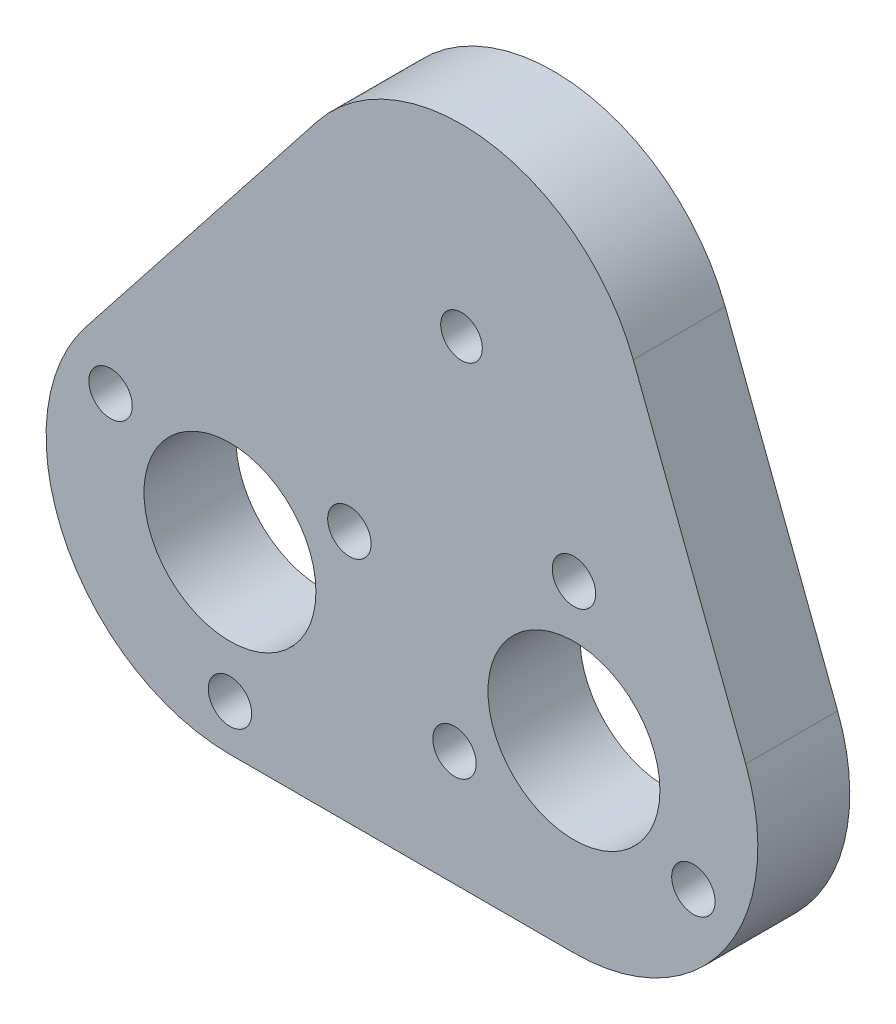
ISO-10303-21;
HEADER;
FILE_DESCRIPTION(('STEP AP214'),'2;1');
FILE_NAME('part.step','',(''),(''),'','','');
FILE_SCHEMA(('AUTOMOTIVE_DESIGN { 1 0 10303 214 1 1 1 1 }'));
ENDSEC;
DATA;
#1=APPLICATION_CONTEXT('core data for automotive mechanical design processes');
#2=APPLICATION_PROTOCOL_DEFINITION('international standard','automotive_design',2000,#1);
#3=PRODUCT_CONTEXT('',#1,'mechanical');
#4=PRODUCT('Part','Part','',(#3));
#5=PRODUCT_RELATED_PRODUCT_CATEGORY('part','',(#4));
#6=PRODUCT_DEFINITION_FORMATION('','',#4);
#7=PRODUCT_DEFINITION_CONTEXT('part definition',#1,'design');
#8=PRODUCT_DEFINITION('design','',#6,#7);
#9=PRODUCT_DEFINITION_SHAPE('','',#8);
#10=(LENGTH_UNIT() NAMED_UNIT(*) SI_UNIT(.MILLI.,.METRE.));
#11=(NAMED_UNIT(*) PLANE_ANGLE_UNIT() SI_UNIT($,.RADIAN.));
#12=(NAMED_UNIT(*) SI_UNIT($,.STERADIAN.) SOLID_ANGLE_UNIT());
#13=UNCERTAINTY_MEASURE_WITH_UNIT(LENGTH_MEASURE(1.E-05),#10,'distance_accuracy_value','');
#14=(GEOMETRIC_REPRESENTATION_CONTEXT(3) GLOBAL_UNCERTAINTY_ASSIGNED_CONTEXT((#13)) GLOBAL_UNIT_ASSIGNED_CONTEXT((#10,
#11,#12)) REPRESENTATION_CONTEXT('',''));
#15=CARTESIAN_POINT('',(0.,0.,0.));
#16=DIRECTION('',(0.,0.,1.));
#17=DIRECTION('',(1.,0.,0.));
#18=AXIS2_PLACEMENT_3D('',#15,#16,#17);
#19=CARTESIAN_POINT('',(0.,-32.9933331036408,6.35));
#20=DIRECTION('',(0.,1.,0.));
#21=DIRECTION('',(0.,0.,1.));
#22=AXIS2_PLACEMENT_3D('',#19,#20,#21);
#23=PLANE('',#22);
#24=DIRECTION('',(1.,0.,0.));
#25=VECTOR('',#24,1.);
#26=CARTESIAN_POINT('',(0.,-32.9933331036408,0.));
#27=LINE('',#26,#25);
#28=CARTESIAN_POINT('',(-15.9905293942784,-32.9933331036408,0.));
#29=VERTEX_POINT('',#28);
#30=CARTESIAN_POINT('',(7.76604539372159,-32.9933331036408,0.));
#31=VERTEX_POINT('',#30);
#32=EDGE_CURVE('E131',#29,#31,#27,.T.);
#33=ORIENTED_EDGE('',*,*,#32,.T.);
#34=DIRECTION('',(0.,0.,-1.));
#35=VECTOR('',#34,1.);
#36=CARTESIAN_POINT('',(7.76604539372159,-32.9933331036408,6.35));
#37=LINE('',#36,#35);
#38=CARTESIAN_POINT('',(7.76604539372159,-32.9933331036408,6.35));
#39=VERTEX_POINT('',#38);
#40=EDGE_CURVE('E11',#39,#31,#37,.T.);
#41=ORIENTED_EDGE('',*,*,#40,.F.);
#42=DIRECTION('',(1.,0.,0.));
#43=VECTOR('',#42,1.);
#44=CARTESIAN_POINT('',(0.,-32.9933331036408,6.35));
#45=LINE('',#44,#43);
#46=CARTESIAN_POINT('',(-15.9905293942784,-32.9933331036408,6.35));
#47=VERTEX_POINT('',#46);
#48=EDGE_CURVE('E154',#47,#39,#45,.T.);
#49=ORIENTED_EDGE('',*,*,#48,.F.);
#50=DIRECTION('',(0.,0.,-1.));
#51=VECTOR('',#50,1.);
#52=CARTESIAN_POINT('',(-15.9905293942784,-32.9933331036408,6.35));
#53=LINE('',#52,#51);
#54=EDGE_CURVE('E130',#47,#29,#53,.T.);
#55=ORIENTED_EDGE('',*,*,#54,.T.);
#56=EDGE_LOOP('',(#33,#41,#49,#55));
#57=FACE_BOUND('',#56,.T.);
#58=ADVANCED_FACE('F39',(#57),#23,.F.);
#59=CARTESIAN_POINT('',(7.76604539372158,-20.2933331036408,6.35));
#60=DIRECTION('',(0.,0.,-1.));
#61=DIRECTION('',(-1.,0.,0.));
#62=AXIS2_PLACEMENT_3D('',#59,#60,#61);
#63=CYLINDRICAL_SURFACE('',#62,12.7);
#64=CARTESIAN_POINT('',(7.76604539372158,-20.2933331036408,0.));
#65=DIRECTION('',(0.,0.,1.));
#66=DIRECTION('',(1.,0.,0.));
#67=AXIS2_PLACEMENT_3D('',#64,#65,#66);
#68=CIRCLE('',#67,12.7);
#69=CARTESIAN_POINT('',(19.627171545731,-15.754204728488,0.));
#70=VERTEX_POINT('',#69);
#71=EDGE_CURVE('E134',#31,#70,#68,.T.);
#72=ORIENTED_EDGE('',*,*,#71,.T.);
#73=DIRECTION('',(0.,0.,-1.));
#74=VECTOR('',#73,1.);
#75=CARTESIAN_POINT('',(19.627171545731,-15.754204728488,6.35));
#76=LINE('',#75,#74);
#77=CARTESIAN_POINT('',(19.627171545731,-15.754204728488,6.35));
#78=VERTEX_POINT('',#77);
#79=EDGE_CURVE('E47',#78,#70,#76,.T.);
#80=ORIENTED_EDGE('',*,*,#79,.F.);
#81=CARTESIAN_POINT('',(7.76604539372158,-20.2933331036408,6.35));
#82=DIRECTION('',(0.,0.,1.));
#83=DIRECTION('',(1.,0.,0.));
#84=AXIS2_PLACEMENT_3D('',#81,#82,#83);
#85=CIRCLE('',#84,12.7);
#86=EDGE_CURVE('E88',#39,#78,#85,.T.);
#87=ORIENTED_EDGE('',*,*,#86,.F.);
#88=ORIENTED_EDGE('',*,*,#40,.T.);
#89=EDGE_LOOP('',(#72,#80,#87,#88));
#90=FACE_BOUND('',#89,.T.);
#91=ADVANCED_FACE('F160',(#90),#63,.T.);
#92=CARTESIAN_POINT('',(11.8611261520095,4.5391283751528,6.35));
#93=DIRECTION('',(0.933946941103107,0.357411683082898,0.));
#94=DIRECTION('',(-0.357411683082898,0.933946941103107,0.));
#95=AXIS2_PLACEMENT_3D('',#92,#93,#94);
#96=PLANE('',#95);
#97=DIRECTION('',(0.357411683082898,-0.933946941103107,0.));
#98=VECTOR('',#97,1.);
#99=CARTESIAN_POINT('',(11.8611261520095,4.5391283751528,0.));
#100=LINE('',#99,#98);
#101=CARTESIAN_POINT('',(11.8611261520095,4.5391283751528,0.));
#102=VERTEX_POINT('',#101);
#103=EDGE_CURVE('E138',#102,#70,#100,.T.);
#104=ORIENTED_EDGE('',*,*,#103,.F.);
#105=DIRECTION('',(0.,0.,-1.));
#106=VECTOR('',#105,1.);
#107=CARTESIAN_POINT('',(11.8611261520095,4.5391283751528,6.35));
#108=LINE('',#107,#106);
#109=CARTESIAN_POINT('',(11.8611261520095,4.5391283751528,6.35));
#110=VERTEX_POINT('',#109);
#111=EDGE_CURVE('E114',#110,#102,#108,.T.);
#112=ORIENTED_EDGE('',*,*,#111,.F.);
#113=DIRECTION('',(0.357411683082898,-0.933946941103107,0.));
#114=VECTOR('',#113,1.);
#115=CARTESIAN_POINT('',(11.8611261520095,4.5391283751528,6.35));
#116=LINE('',#115,#114);
#117=EDGE_CURVE('E103',#110,#78,#116,.T.);
#118=ORIENTED_EDGE('',*,*,#117,.T.);
#119=ORIENTED_EDGE('',*,*,#79,.T.);
#120=EDGE_LOOP('',(#104,#112,#118,#119));
#121=FACE_BOUND('',#120,.T.);
#122=ADVANCED_FACE('F159',(#121),#96,.T.);
#123=CARTESIAN_POINT('',(0.,0.,6.35));
#124=DIRECTION('',(0.,0.,-1.));
#125=DIRECTION('',(-1.,0.,0.));
#126=AXIS2_PLACEMENT_3D('',#123,#124,#125);
#127=CYLINDRICAL_SURFACE('',#126,12.7);
#128=CARTESIAN_POINT('',(0.,0.,0.));
#129=DIRECTION('',(0.,0.,1.));
#130=DIRECTION('',(1.,0.,0.));
#131=AXIS2_PLACEMENT_3D('',#128,#129,#130);
#132=CIRCLE('',#131,12.7);
#133=CARTESIAN_POINT('',(-9.97530389849243,7.86023613721125,0.));
#134=VERTEX_POINT('',#133);
#135=EDGE_CURVE('E110',#102,#134,#132,.T.);
#136=ORIENTED_EDGE('',*,*,#135,.T.);
#137=DIRECTION('',(0.,0.,-1.));
#138=VECTOR('',#137,1.);
#139=CARTESIAN_POINT('',(-9.97530389849243,7.86023613721125,6.35));
#140=LINE('',#139,#138);
#141=CARTESIAN_POINT('',(-9.97530389849243,7.86023613721125,6.35));
#142=VERTEX_POINT('',#141);
#143=EDGE_CURVE('E107',#142,#134,#140,.T.);
#144=ORIENTED_EDGE('',*,*,#143,.F.);
#145=CARTESIAN_POINT('',(0.,0.,6.35));
#146=DIRECTION('',(0.,0.,1.));
#147=DIRECTION('',(1.,0.,0.));
#148=AXIS2_PLACEMENT_3D('',#145,#146,#147);
#149=CIRCLE('',#148,12.7);
#150=EDGE_CURVE('E96',#110,#142,#149,.T.);
#151=ORIENTED_EDGE('',*,*,#150,.F.);
#152=ORIENTED_EDGE('',*,*,#111,.T.);
#153=EDGE_LOOP('',(#136,#144,#151,#152));
#154=FACE_BOUND('',#153,.T.);
#155=ADVANCED_FACE('F108',(#154),#127,.T.);
#156=CARTESIAN_POINT('',(-9.97530389849242,7.86023613721126,6.35));
#157=DIRECTION('',(-0.785456999881293,0.618916231276477,0.));
#158=DIRECTION('',(-0.618916231276477,-0.785456999881294,0.));
#159=AXIS2_PLACEMENT_3D('',#156,#157,#158);
#160=PLANE('',#159);
#161=DIRECTION('',(0.618916231276477,0.785456999881294,0.));
#162=VECTOR('',#161,1.);
#163=CARTESIAN_POINT('',(-9.97530389849242,7.86023613721126,0.));
#164=LINE('',#163,#162);
#165=CARTESIAN_POINT('',(-25.9658332927708,-12.4330969664296,0.));
#166=VERTEX_POINT('',#165);
#167=EDGE_CURVE('E142',#166,#134,#164,.T.);
#168=ORIENTED_EDGE('',*,*,#167,.F.);
#169=DIRECTION('',(0.,0.,-1.));
#170=VECTOR('',#169,1.);
#171=CARTESIAN_POINT('',(-25.9658332927708,-12.4330969664296,6.35));
#172=LINE('',#171,#170);
#173=CARTESIAN_POINT('',(-25.9658332927708,-12.4330969664296,6.35));
#174=VERTEX_POINT('',#173);
#175=EDGE_CURVE('E77',#174,#166,#172,.T.);
#176=ORIENTED_EDGE('',*,*,#175,.F.);
#177=DIRECTION('',(0.618916231276477,0.785456999881294,0.));
#178=VECTOR('',#177,1.);
#179=CARTESIAN_POINT('',(-9.97530389849242,7.86023613721126,6.35));
#180=LINE('',#179,#178);
#181=EDGE_CURVE('E101',#174,#142,#180,.T.);
#182=ORIENTED_EDGE('',*,*,#181,.T.);
#183=ORIENTED_EDGE('',*,*,#143,.T.);
#184=EDGE_LOOP('',(#168,#176,#182,#183));
#185=FACE_BOUND('',#184,.T.);
#186=ADVANCED_FACE('F116',(#185),#160,.T.);
#187=CARTESIAN_POINT('',(0.,0.,6.35));
#188=DIRECTION('',(0.,0.,-1.));
#189=DIRECTION('',(-1.,0.,0.));
#190=AXIS2_PLACEMENT_3D('',#187,#188,#189);
#191=CYLINDRICAL_SURFACE('',#190,1.4375);
#192=CARTESIAN_POINT('',(0.,0.,6.35));
#193=DIRECTION('',(0.,0.,1.));
#194=DIRECTION('',(1.,0.,0.));
#195=AXIS2_PLACEMENT_3D('',#192,#193,#194);
#196=CIRCLE('',#195,1.4375);
#197=CARTESIAN_POINT('',(1.4375,0.,6.35));
#198=VERTEX_POINT('',#197);
#199=EDGE_CURVE('E124',#198,#198,#196,.T.);
#200=ORIENTED_EDGE('',*,*,#199,.T.);
#201=EDGE_LOOP('',(#200));
#202=FACE_BOUND('',#201,.T.);
#203=CARTESIAN_POINT('',(0.,0.,0.));
#204=DIRECTION('',(0.,0.,1.));
#205=DIRECTION('',(1.,0.,0.));
#206=AXIS2_PLACEMENT_3D('',#203,#204,#205);
#207=CIRCLE('',#206,1.4375);
#208=CARTESIAN_POINT('',(1.4375,0.,0.));
#209=VERTEX_POINT('',#208);
#210=EDGE_CURVE('E148',#209,#209,#207,.T.);
#211=ORIENTED_EDGE('',*,*,#210,.F.);
#212=EDGE_LOOP('',(#211));
#213=FACE_BOUND('',#212,.T.);
#214=ADVANCED_FACE('F179',(#202,#213),#191,.F.);
#215=CARTESIAN_POINT('',(-15.9905293942784,-20.2933331036408,6.35));
#216=DIRECTION('',(0.,0.,-1.));
#217=DIRECTION('',(-1.,0.,0.));
#218=AXIS2_PLACEMENT_3D('',#215,#216,#217);
#219=CYLINDRICAL_SURFACE('',#218,5.9375);
#220=CARTESIAN_POINT('',(-15.9905293942784,-20.2933331036408,6.35));
#221=DIRECTION('',(0.,0.,1.));
#222=DIRECTION('',(1.,0.,0.));
#223=AXIS2_PLACEMENT_3D('',#220,#221,#222);
#224=CIRCLE('',#223,5.9375);
#225=CARTESIAN_POINT('',(-10.0530293942784,-20.2933331036408,6.35));
#226=VERTEX_POINT('',#225);
#227=EDGE_CURVE('E118',#226,#226,#224,.T.);
#228=ORIENTED_EDGE('',*,*,#227,.T.);
#229=EDGE_LOOP('',(#228));
#230=FACE_BOUND('',#229,.T.);
#231=CARTESIAN_POINT('',(-15.9905293942784,-20.2933331036408,0.));
#232=DIRECTION('',(0.,0.,1.));
#233=DIRECTION('',(1.,0.,0.));
#234=AXIS2_PLACEMENT_3D('',#231,#232,#233);
#235=CIRCLE('',#234,5.9375);
#236=CARTESIAN_POINT('',(-10.0530293942784,-20.2933331036408,0.));
#237=VERTEX_POINT('',#236);
#238=EDGE_CURVE('E145',#237,#237,#235,.T.);
#239=ORIENTED_EDGE('',*,*,#238,.F.);
#240=EDGE_LOOP('',(#239));
#241=FACE_BOUND('',#240,.T.);
#242=ADVANCED_FACE('F171',(#230,#241),#219,.F.);
#243=CARTESIAN_POINT('',(-15.9905293942784,-20.2933331036408,6.35));
#244=DIRECTION('',(0.,0.,-1.));
#245=DIRECTION('',(-1.,0.,0.));
#246=AXIS2_PLACEMENT_3D('',#243,#244,#245);
#247=CYLINDRICAL_SURFACE('',#246,12.7);
#248=CARTESIAN_POINT('',(-15.9905293942784,-20.2933331036408,0.));
#249=DIRECTION('',(0.,0.,1.));
#250=DIRECTION('',(1.,0.,0.));
#251=AXIS2_PLACEMENT_3D('',#248,#249,#250);
#252=CIRCLE('',#251,12.7);
#253=EDGE_CURVE('E80',#166,#29,#252,.T.);
#254=ORIENTED_EDGE('',*,*,#253,.T.);
#255=ORIENTED_EDGE('',*,*,#54,.F.);
#256=CARTESIAN_POINT('',(-15.9905293942784,-20.2933331036408,6.35));
#257=DIRECTION('',(0.,0.,1.));
#258=DIRECTION('',(1.,0.,0.));
#259=AXIS2_PLACEMENT_3D('',#256,#257,#258);
#260=CIRCLE('',#259,12.7);
#261=EDGE_CURVE('E55',#174,#47,#260,.T.);
#262=ORIENTED_EDGE('',*,*,#261,.F.);
#263=ORIENTED_EDGE('',*,*,#175,.T.);
#264=EDGE_LOOP('',(#254,#255,#262,#263));
#265=FACE_BOUND('',#264,.T.);
#266=ADVANCED_FACE('F168',(#265),#247,.T.);
#267=CARTESIAN_POINT('',(7.76604539372158,-20.2933331036408,6.35));
#268=DIRECTION('',(0.,0.,-1.));
#269=DIRECTION('',(-1.,0.,0.));
#270=AXIS2_PLACEMENT_3D('',#267,#268,#269);
#271=CYLINDRICAL_SURFACE('',#270,5.9375);
#272=CARTESIAN_POINT('',(7.76604539372158,-20.2933331036408,6.35));
#273=DIRECTION('',(0.,0.,1.));
#274=DIRECTION('',(1.,0.,0.));
#275=AXIS2_PLACEMENT_3D('',#272,#273,#274);
#276=CIRCLE('',#275,5.9375);
#277=CARTESIAN_POINT('',(13.7035453937216,-20.2933331036408,6.35));
#278=VERTEX_POINT('',#277);
#279=EDGE_CURVE('E127',#278,#278,#276,.T.);
#280=ORIENTED_EDGE('',*,*,#279,.T.);
#281=EDGE_LOOP('',(#280));
#282=FACE_BOUND('',#281,.T.);
#283=CARTESIAN_POINT('',(7.76604539372158,-20.2933331036408,0.));
#284=DIRECTION('',(0.,0.,1.));
#285=DIRECTION('',(1.,0.,0.));
#286=AXIS2_PLACEMENT_3D('',#283,#284,#285);
#287=CIRCLE('',#286,5.9375);
#288=CARTESIAN_POINT('',(13.7035453937216,-20.2933331036408,0.));
#289=VERTEX_POINT('',#288);
#290=EDGE_CURVE('E151',#289,#289,#287,.T.);
#291=ORIENTED_EDGE('',*,*,#290,.F.);
#292=EDGE_LOOP('',(#291));
#293=FACE_BOUND('',#292,.T.);
#294=ADVANCED_FACE('F170',(#282,#293),#271,.F.);
#295=CARTESIAN_POINT('',(0.,0.,6.35));
#296=DIRECTION('',(0.,0.,1.));
#297=DIRECTION('',(1.,0.,0.));
#298=AXIS2_PLACEMENT_3D('',#295,#296,#297);
#299=PLANE('',#298);
#300=CARTESIAN_POINT('',(7.76604539372158,-10.7683331036408,6.35));
#301=DIRECTION('',(0.,0.,1.));
#302=DIRECTION('',(1.,0.,0.));
#303=AXIS2_PLACEMENT_3D('',#300,#301,#302);
#304=CIRCLE('',#303,1.5);
#305=CARTESIAN_POINT('',(9.26604539372158,-10.7683331036408,6.35));
#306=VERTEX_POINT('',#305);
#307=EDGE_CURVE('E239',#306,#306,#304,.T.);
#308=ORIENTED_EDGE('',*,*,#307,.F.);
#309=EDGE_LOOP('',(#308));
#310=FACE_BOUND('',#309,.T.);
#311=CARTESIAN_POINT('',(-0.482846577324838,-25.055833103641,6.35));
#312=DIRECTION('',(0.,0.,1.));
#313=DIRECTION('',(1.,0.,0.));
#314=AXIS2_PLACEMENT_3D('',#311,#312,#313);
#315=CIRCLE('',#314,1.5);
#316=CARTESIAN_POINT('',(1.01715342267516,-25.055833103641,6.35));
#317=VERTEX_POINT('',#316);
#318=EDGE_CURVE('E251',#317,#317,#315,.T.);
#319=ORIENTED_EDGE('',*,*,#318,.F.);
#320=EDGE_LOOP('',(#319));
#321=FACE_BOUND('',#320,.T.);
#322=CARTESIAN_POINT('',(16.0149373647687,-25.0558331036406,6.35));
#323=DIRECTION('',(0.,0.,1.));
#324=DIRECTION('',(1.,0.,0.));
#325=AXIS2_PLACEMENT_3D('',#322,#323,#324);
#326=CIRCLE('',#325,1.5);
#327=CARTESIAN_POINT('',(17.5149373647687,-25.0558331036406,6.35));
#328=VERTEX_POINT('',#327);
#329=EDGE_CURVE('E250',#328,#328,#326,.T.);
#330=ORIENTED_EDGE('',*,*,#329,.F.);
#331=EDGE_LOOP('',(#330));
#332=FACE_BOUND('',#331,.T.);
#333=CARTESIAN_POINT('',(-7.74163742323159,-15.5308331036409,6.35));
#334=DIRECTION('',(0.,0.,1.));
#335=DIRECTION('',(1.,0.,0.));
#336=AXIS2_PLACEMENT_3D('',#333,#334,#335);
#337=CIRCLE('',#336,1.5);
#338=CARTESIAN_POINT('',(-6.24163742323159,-15.5308331036409,6.35));
#339=VERTEX_POINT('',#338);
#340=EDGE_CURVE('E265',#339,#339,#337,.T.);
#341=ORIENTED_EDGE('',*,*,#340,.F.);
#342=EDGE_LOOP('',(#341));
#343=FACE_BOUND('',#342,.T.);
#344=CARTESIAN_POINT('',(-24.2394213653252,-15.5308331036408,6.35));
#345=DIRECTION('',(0.,0.,1.));
#346=DIRECTION('',(1.,0.,0.));
#347=AXIS2_PLACEMENT_3D('',#344,#345,#346);
#348=CIRCLE('',#347,1.5);
#349=CARTESIAN_POINT('',(-22.7394213653252,-15.5308331036408,6.35));
#350=VERTEX_POINT('',#349);
#351=EDGE_CURVE('E259',#350,#350,#348,.T.);
#352=ORIENTED_EDGE('',*,*,#351,.F.);
#353=EDGE_LOOP('',(#352));
#354=FACE_BOUND('',#353,.T.);
#355=CARTESIAN_POINT('',(-15.9905293942784,-29.8183331036408,6.35));
#356=DIRECTION('',(0.,0.,1.));
#357=DIRECTION('',(1.,0.,0.));
#358=AXIS2_PLACEMENT_3D('',#355,#356,#357);
#359=CIRCLE('',#358,1.5);
#360=CARTESIAN_POINT('',(-14.4905293942784,-29.8183331036408,6.35));
#361=VERTEX_POINT('',#360);
#362=EDGE_CURVE('E244',#361,#361,#359,.T.);
#363=ORIENTED_EDGE('',*,*,#362,.F.);
#364=EDGE_LOOP('',(#363));
#365=FACE_BOUND('',#364,.T.);
#366=ORIENTED_EDGE('',*,*,#48,.T.);
#367=ORIENTED_EDGE('',*,*,#86,.T.);
#368=ORIENTED_EDGE('',*,*,#117,.F.);
#369=ORIENTED_EDGE('',*,*,#150,.T.);
#370=ORIENTED_EDGE('',*,*,#181,.F.);
#371=ORIENTED_EDGE('',*,*,#261,.T.);
#372=EDGE_LOOP('',(#366,#367,#368,#369,#370,#371));
#373=FACE_BOUND('',#372,.T.);
#374=ORIENTED_EDGE('',*,*,#227,.F.);
#375=EDGE_LOOP('',(#374));
#376=FACE_BOUND('',#375,.T.);
#377=ORIENTED_EDGE('',*,*,#199,.F.);
#378=EDGE_LOOP('',(#377));
#379=FACE_BOUND('',#378,.T.);
#380=ORIENTED_EDGE('',*,*,#279,.F.);
#381=EDGE_LOOP('',(#380));
#382=FACE_BOUND('',#381,.T.);
#383=ADVANCED_FACE('F98',(#310,#321,#332,#343,#354,#365,#373,#376,#379,#382),#299,.T.);
#384=CARTESIAN_POINT('',(0.,0.,0.));
#385=DIRECTION('',(0.,0.,1.));
#386=DIRECTION('',(1.,0.,0.));
#387=AXIS2_PLACEMENT_3D('',#384,#385,#386);
#388=PLANE('',#387);
#389=CARTESIAN_POINT('',(7.76604539372158,-10.7683331036408,0.));
#390=DIRECTION('',(0.,0.,1.));
#391=DIRECTION('',(1.,0.,0.));
#392=AXIS2_PLACEMENT_3D('',#389,#390,#391);
#393=CIRCLE('',#392,1.5);
#394=CARTESIAN_POINT('',(9.26604539372158,-10.7683331036408,0.));
#395=VERTEX_POINT('',#394);
#396=EDGE_CURVE('E135',#395,#395,#393,.T.);
#397=ORIENTED_EDGE('',*,*,#396,.T.);
#398=EDGE_LOOP('',(#397));
#399=FACE_BOUND('',#398,.T.);
#400=CARTESIAN_POINT('',(-0.482846577324838,-25.055833103641,0.));
#401=DIRECTION('',(0.,0.,1.));
#402=DIRECTION('',(1.,0.,0.));
#403=AXIS2_PLACEMENT_3D('',#400,#401,#402);
#404=CIRCLE('',#403,1.5);
#405=CARTESIAN_POINT('',(1.01715342267516,-25.055833103641,0.));
#406=VERTEX_POINT('',#405);
#407=EDGE_CURVE('E247',#406,#406,#404,.T.);
#408=ORIENTED_EDGE('',*,*,#407,.T.);
#409=EDGE_LOOP('',(#408));
#410=FACE_BOUND('',#409,.T.);
#411=CARTESIAN_POINT('',(16.0149373647687,-25.0558331036406,0.));
#412=DIRECTION('',(0.,0.,1.));
#413=DIRECTION('',(1.,0.,0.));
#414=AXIS2_PLACEMENT_3D('',#411,#412,#413);
#415=CIRCLE('',#414,1.5);
#416=CARTESIAN_POINT('',(17.5149373647687,-25.0558331036406,0.));
#417=VERTEX_POINT('',#416);
#418=EDGE_CURVE('E268',#417,#417,#415,.T.);
#419=ORIENTED_EDGE('',*,*,#418,.T.);
#420=EDGE_LOOP('',(#419));
#421=FACE_BOUND('',#420,.T.);
#422=CARTESIAN_POINT('',(-7.74163742323159,-15.5308331036409,0.));
#423=DIRECTION('',(0.,0.,1.));
#424=DIRECTION('',(1.,0.,0.));
#425=AXIS2_PLACEMENT_3D('',#422,#423,#424);
#426=CIRCLE('',#425,1.5);
#427=CARTESIAN_POINT('',(-6.24163742323159,-15.5308331036409,0.));
#428=VERTEX_POINT('',#427);
#429=EDGE_CURVE('E262',#428,#428,#426,.T.);
#430=ORIENTED_EDGE('',*,*,#429,.T.);
#431=EDGE_LOOP('',(#430));
#432=FACE_BOUND('',#431,.T.);
#433=CARTESIAN_POINT('',(-24.2394213653252,-15.5308331036408,0.));
#434=DIRECTION('',(0.,0.,1.));
#435=DIRECTION('',(1.,0.,0.));
#436=AXIS2_PLACEMENT_3D('',#433,#434,#435);
#437=CIRCLE('',#436,1.5);
#438=CARTESIAN_POINT('',(-22.7394213653252,-15.5308331036408,0.));
#439=VERTEX_POINT('',#438);
#440=EDGE_CURVE('E256',#439,#439,#437,.T.);
#441=ORIENTED_EDGE('',*,*,#440,.T.);
#442=EDGE_LOOP('',(#441));
#443=FACE_BOUND('',#442,.T.);
#444=CARTESIAN_POINT('',(-15.9905293942784,-29.8183331036408,0.));
#445=DIRECTION('',(0.,0.,1.));
#446=DIRECTION('',(1.,0.,0.));
#447=AXIS2_PLACEMENT_3D('',#444,#445,#446);
#448=CIRCLE('',#447,1.5);
#449=CARTESIAN_POINT('',(-14.4905293942784,-29.8183331036408,0.));
#450=VERTEX_POINT('',#449);
#451=EDGE_CURVE('E240',#450,#450,#448,.T.);
#452=ORIENTED_EDGE('',*,*,#451,.T.);
#453=EDGE_LOOP('',(#452));
#454=FACE_BOUND('',#453,.T.);
#455=ORIENTED_EDGE('',*,*,#32,.F.);
#456=ORIENTED_EDGE('',*,*,#253,.F.);
#457=ORIENTED_EDGE('',*,*,#167,.T.);
#458=ORIENTED_EDGE('',*,*,#135,.F.);
#459=ORIENTED_EDGE('',*,*,#103,.T.);
#460=ORIENTED_EDGE('',*,*,#71,.F.);
#461=EDGE_LOOP('',(#455,#456,#457,#458,#459,#460));
#462=FACE_BOUND('',#461,.T.);
#463=ORIENTED_EDGE('',*,*,#238,.T.);
#464=EDGE_LOOP('',(#463));
#465=FACE_BOUND('',#464,.T.);
#466=ORIENTED_EDGE('',*,*,#210,.T.);
#467=EDGE_LOOP('',(#466));
#468=FACE_BOUND('',#467,.T.);
#469=ORIENTED_EDGE('',*,*,#290,.T.);
#470=EDGE_LOOP('',(#469));
#471=FACE_BOUND('',#470,.T.);
#472=ADVANCED_FACE('F164',(#399,#410,#421,#432,#443,#454,#462,#465,#468,#471),#388,.F.);
#473=CARTESIAN_POINT('',(-15.9905293942784,-29.8183331036408,0.));
#474=DIRECTION('',(0.,0.,1.));
#475=DIRECTION('',(1.,0.,0.));
#476=AXIS2_PLACEMENT_3D('',#473,#474,#475);
#477=CYLINDRICAL_SURFACE('',#476,1.5);
#478=ORIENTED_EDGE('',*,*,#451,.F.);
#479=EDGE_LOOP('',(#478));
#480=FACE_BOUND('',#479,.T.);
#481=ORIENTED_EDGE('',*,*,#362,.T.);
#482=EDGE_LOOP('',(#481));
#483=FACE_BOUND('',#482,.T.);
#484=ADVANCED_FACE('F205',(#480,#483),#477,.F.);
#485=CARTESIAN_POINT('',(-24.2394213653252,-15.5308331036408,0.));
#486=DIRECTION('',(0.,0.,1.));
#487=DIRECTION('',(1.,0.,0.));
#488=AXIS2_PLACEMENT_3D('',#485,#486,#487);
#489=CYLINDRICAL_SURFACE('',#488,1.5);
#490=ORIENTED_EDGE('',*,*,#440,.F.);
#491=EDGE_LOOP('',(#490));
#492=FACE_BOUND('',#491,.T.);
#493=ORIENTED_EDGE('',*,*,#351,.T.);
#494=EDGE_LOOP('',(#493));
#495=FACE_BOUND('',#494,.T.);
#496=ADVANCED_FACE('F218',(#492,#495),#489,.F.);
#497=CARTESIAN_POINT('',(-7.74163742323159,-15.5308331036409,0.));
#498=DIRECTION('',(0.,0.,1.));
#499=DIRECTION('',(1.,0.,0.));
#500=AXIS2_PLACEMENT_3D('',#497,#498,#499);
#501=CYLINDRICAL_SURFACE('',#500,1.5);
#502=ORIENTED_EDGE('',*,*,#429,.F.);
#503=EDGE_LOOP('',(#502));
#504=FACE_BOUND('',#503,.T.);
#505=ORIENTED_EDGE('',*,*,#340,.T.);
#506=EDGE_LOOP('',(#505));
#507=FACE_BOUND('',#506,.T.);
#508=ADVANCED_FACE('F214',(#504,#507),#501,.F.);
#509=CARTESIAN_POINT('',(16.0149373647687,-25.0558331036406,0.));
#510=DIRECTION('',(0.,0.,1.));
#511=DIRECTION('',(1.,0.,0.));
#512=AXIS2_PLACEMENT_3D('',#509,#510,#511);
#513=CYLINDRICAL_SURFACE('',#512,1.5);
#514=ORIENTED_EDGE('',*,*,#418,.F.);
#515=EDGE_LOOP('',(#514));
#516=FACE_BOUND('',#515,.T.);
#517=ORIENTED_EDGE('',*,*,#329,.T.);
#518=EDGE_LOOP('',(#517));
#519=FACE_BOUND('',#518,.T.);
#520=ADVANCED_FACE('F210',(#516,#519),#513,.F.);
#521=CARTESIAN_POINT('',(-0.482846577324838,-25.055833103641,0.));
#522=DIRECTION('',(0.,0.,1.));
#523=DIRECTION('',(1.,0.,0.));
#524=AXIS2_PLACEMENT_3D('',#521,#522,#523);
#525=CYLINDRICAL_SURFACE('',#524,1.5);
#526=ORIENTED_EDGE('',*,*,#407,.F.);
#527=EDGE_LOOP('',(#526));
#528=FACE_BOUND('',#527,.T.);
#529=ORIENTED_EDGE('',*,*,#318,.T.);
#530=EDGE_LOOP('',(#529));
#531=FACE_BOUND('',#530,.T.);
#532=ADVANCED_FACE('F213',(#528,#531),#525,.F.);
#533=CARTESIAN_POINT('',(7.76604539372158,-10.7683331036408,0.));
#534=DIRECTION('',(0.,0.,1.));
#535=DIRECTION('',(1.,0.,0.));
#536=AXIS2_PLACEMENT_3D('',#533,#534,#535);
#537=CYLINDRICAL_SURFACE('',#536,1.5);
#538=ORIENTED_EDGE('',*,*,#396,.F.);
#539=EDGE_LOOP('',(#538));
#540=FACE_BOUND('',#539,.T.);
#541=ORIENTED_EDGE('',*,*,#307,.T.);
#542=EDGE_LOOP('',(#541));
#543=FACE_BOUND('',#542,.T.);
#544=ADVANCED_FACE('F228',(#540,#543),#537,.F.);
#545=CLOSED_SHELL('',(#58,#91,#122,#155,#186,#214,#242,#266,#294,#383,#472,#484,#496,#508,#520,
#532,#544));
#546=MANIFOLD_SOLID_BREP('B2',#545);
#547=ADVANCED_BREP_SHAPE_REPRESENTATION('',(#18,#546),#14);
#548=SHAPE_DEFINITION_REPRESENTATION(#9,#547);
ENDSEC;
END-ISO-10303-21;
